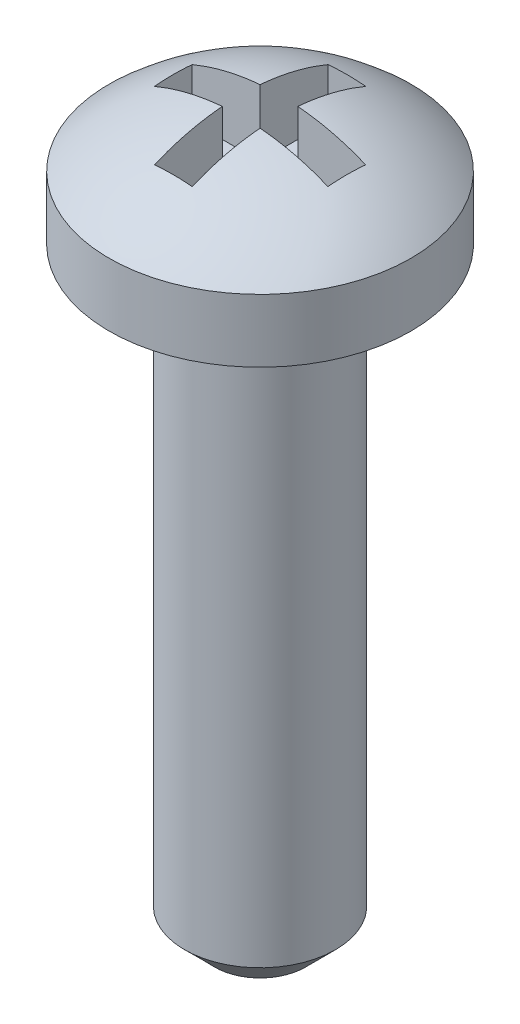
ISO-10303-21;
HEADER;
FILE_DESCRIPTION(('STEP AP214'),'2;1');
FILE_NAME('part.step','',(''),(''),'','','');
FILE_SCHEMA(('AUTOMOTIVE_DESIGN { 1 0 10303 214 1 1 1 1 }'));
ENDSEC;
DATA;
#1=APPLICATION_CONTEXT('core data for automotive mechanical design processes');
#2=APPLICATION_PROTOCOL_DEFINITION('international standard','automotive_design',2000,#1);
#3=PRODUCT_CONTEXT('',#1,'mechanical');
#4=PRODUCT('Part','Part','',(#3));
#5=PRODUCT_RELATED_PRODUCT_CATEGORY('part','',(#4));
#6=PRODUCT_DEFINITION_FORMATION('','',#4);
#7=PRODUCT_DEFINITION_CONTEXT('part definition',#1,'design');
#8=PRODUCT_DEFINITION('design','',#6,#7);
#9=PRODUCT_DEFINITION_SHAPE('','',#8);
#10=(LENGTH_UNIT() NAMED_UNIT(*) SI_UNIT(.MILLI.,.METRE.));
#11=(NAMED_UNIT(*) PLANE_ANGLE_UNIT() SI_UNIT($,.RADIAN.));
#12=(NAMED_UNIT(*) SI_UNIT($,.STERADIAN.) SOLID_ANGLE_UNIT());
#13=UNCERTAINTY_MEASURE_WITH_UNIT(LENGTH_MEASURE(1.E-05),#10,'distance_accuracy_value','');
#14=(GEOMETRIC_REPRESENTATION_CONTEXT(3) GLOBAL_UNCERTAINTY_ASSIGNED_CONTEXT((#13)) GLOBAL_UNIT_ASSIGNED_CONTEXT((#10,
#11,#12)) REPRESENTATION_CONTEXT('',''));
#15=CARTESIAN_POINT('',(0.,0.,0.));
#16=DIRECTION('',(0.,0.,1.));
#17=DIRECTION('',(1.,0.,0.));
#18=AXIS2_PLACEMENT_3D('',#15,#16,#17);
#19=CARTESIAN_POINT('',(0.,-8.,0.));
#20=DIRECTION('',(0.,-1.,0.));
#21=DIRECTION('',(1.,0.,0.));
#22=AXIS2_PLACEMENT_3D('',#19,#20,#21);
#23=CYLINDRICAL_SURFACE('',#22,1.);
#24=CARTESIAN_POINT('',(0.,-7.6,0.));
#25=DIRECTION('',(0.,-1.,0.));
#26=DIRECTION('',(1.,0.,0.));
#27=AXIS2_PLACEMENT_3D('',#24,#25,#26);
#28=CIRCLE('',#27,0.999999999999999);
#29=CARTESIAN_POINT('',(0.999999999999999,-7.6,0.));
#30=VERTEX_POINT('',#29);
#31=EDGE_CURVE('E175',#30,#30,#28,.T.);
#32=ORIENTED_EDGE('',*,*,#31,.F.);
#33=EDGE_LOOP('',(#32));
#34=FACE_BOUND('',#33,.T.);
#35=CARTESIAN_POINT('',(0.,0.,0.));
#36=DIRECTION('',(0.,-1.,0.));
#37=DIRECTION('',(1.,0.,0.));
#38=AXIS2_PLACEMENT_3D('',#35,#36,#37);
#39=CIRCLE('',#38,1.);
#40=CARTESIAN_POINT('',(1.,0.,0.));
#41=VERTEX_POINT('',#40);
#42=EDGE_CURVE('E206',#41,#41,#39,.T.);
#43=ORIENTED_EDGE('',*,*,#42,.T.);
#44=EDGE_LOOP('',(#43));
#45=FACE_BOUND('',#44,.T.);
#46=ADVANCED_FACE('F40',(#34,#45),#23,.T.);
#47=CARTESIAN_POINT('',(-2.,0.,0.));
#48=DIRECTION('',(0.,1.,0.));
#49=DIRECTION('',(-1.,0.,0.));
#50=AXIS2_PLACEMENT_3D('',#47,#48,#49);
#51=PLANE('',#50);
#52=ORIENTED_EDGE('',*,*,#42,.F.);
#53=EDGE_LOOP('',(#52));
#54=FACE_BOUND('',#53,.T.);
#55=CARTESIAN_POINT('',(0.,0.,0.));
#56=DIRECTION('',(0.,-1.,0.));
#57=DIRECTION('',(1.,0.,0.));
#58=AXIS2_PLACEMENT_3D('',#55,#56,#57);
#59=CIRCLE('',#58,2.);
#60=CARTESIAN_POINT('',(2.,0.,0.));
#61=VERTEX_POINT('',#60);
#62=EDGE_CURVE('E203',#61,#61,#59,.T.);
#63=ORIENTED_EDGE('',*,*,#62,.T.);
#64=EDGE_LOOP('',(#63));
#65=FACE_BOUND('',#64,.T.);
#66=ADVANCED_FACE('F285',(#54,#65),#51,.F.);
#67=CARTESIAN_POINT('',(0.,-8.,0.));
#68=DIRECTION('',(0.,-1.,0.));
#69=DIRECTION('',(1.,0.,0.));
#70=AXIS2_PLACEMENT_3D('',#67,#68,#69);
#71=CYLINDRICAL_SURFACE('',#70,2.);
#72=ORIENTED_EDGE('',*,*,#62,.F.);
#73=EDGE_LOOP('',(#72));
#74=FACE_BOUND('',#73,.T.);
#75=CARTESIAN_POINT('',(0.,0.836067977499791,0.));
#76=DIRECTION('',(0.,-1.,0.));
#77=DIRECTION('',(1.,0.,0.));
#78=AXIS2_PLACEMENT_3D('',#75,#76,#77);
#79=CIRCLE('',#78,2.);
#80=CARTESIAN_POINT('',(2.,0.83606797749979,0.));
#81=VERTEX_POINT('',#80);
#82=EDGE_CURVE('E200',#81,#81,#79,.T.);
#83=ORIENTED_EDGE('',*,*,#82,.T.);
#84=EDGE_LOOP('',(#83));
#85=FACE_BOUND('',#84,.T.);
#86=ADVANCED_FACE('F290',(#74,#85),#71,.T.);
#87=CARTESIAN_POINT('',(0.,-1.4,0.));
#88=DIRECTION('',(0.,-1.,0.));
#89=DIRECTION('',(1.,0.,0.));
#90=AXIS2_PLACEMENT_3D('',#87,#88,#89);
#91=SPHERICAL_SURFACE('',#90,3.);
#92=CARTESIAN_POINT('',(0.,-1.4,1.15));
#93=DIRECTION('',(0.,0.,1.));
#94=DIRECTION('',(1.,0.,0.));
#95=AXIS2_PLACEMENT_3D('',#92,#93,#94);
#96=CIRCLE('',#95,2.77083020049948);
#97=CARTESIAN_POINT('',(0.25,1.35952894530933,1.15));
#98=VERTEX_POINT('',#97);
#99=CARTESIAN_POINT('',(-0.25,1.35952894530933,1.15));
#100=VERTEX_POINT('',#99);
#101=EDGE_CURVE('E47',#98,#100,#96,.T.);
#102=ORIENTED_EDGE('',*,*,#101,.T.);
#103=CARTESIAN_POINT('',(-0.25,-1.4,0.));
#104=DIRECTION('',(-1.,0.,0.));
#105=DIRECTION('',(0.,0.,1.));
#106=AXIS2_PLACEMENT_3D('',#103,#104,#105);
#107=CIRCLE('',#106,2.98956518577535);
#108=CARTESIAN_POINT('',(-0.25,1.57909382195325,0.25));
#109=VERTEX_POINT('',#108);
#110=EDGE_CURVE('E11',#100,#109,#107,.T.);
#111=ORIENTED_EDGE('',*,*,#110,.T.);
#112=CARTESIAN_POINT('',(0.,-1.4,0.25));
#113=DIRECTION('',(0.,0.,1.));
#114=DIRECTION('',(1.,0.,0.));
#115=AXIS2_PLACEMENT_3D('',#112,#113,#114);
#116=CIRCLE('',#115,2.98956518577535);
#117=CARTESIAN_POINT('',(-1.15,1.35952894530933,0.25));
#118=VERTEX_POINT('',#117);
#119=EDGE_CURVE('E129',#109,#118,#116,.T.);
#120=ORIENTED_EDGE('',*,*,#119,.T.);
#121=CARTESIAN_POINT('',(-1.15,-1.4,0.));
#122=DIRECTION('',(-1.,0.,0.));
#123=DIRECTION('',(0.,-1.,0.));
#124=AXIS2_PLACEMENT_3D('',#121,#122,#123);
#125=CIRCLE('',#124,2.77083020049948);
#126=CARTESIAN_POINT('',(-1.15,1.35952894530933,-0.25));
#127=VERTEX_POINT('',#126);
#128=EDGE_CURVE('E210',#118,#127,#125,.T.);
#129=ORIENTED_EDGE('',*,*,#128,.T.);
#130=CARTESIAN_POINT('',(0.,-1.4,-0.25));
#131=DIRECTION('',(0.,0.,-1.));
#132=DIRECTION('',(-1.,0.,0.));
#133=AXIS2_PLACEMENT_3D('',#130,#131,#132);
#134=CIRCLE('',#133,2.98956518577535);
#135=CARTESIAN_POINT('',(-0.25,1.57909382195325,-0.25));
#136=VERTEX_POINT('',#135);
#137=EDGE_CURVE('E213',#127,#136,#134,.T.);
#138=ORIENTED_EDGE('',*,*,#137,.T.);
#139=CARTESIAN_POINT('',(-0.25,-1.4,0.));
#140=DIRECTION('',(-1.,0.,0.));
#141=DIRECTION('',(0.,0.,1.));
#142=AXIS2_PLACEMENT_3D('',#139,#140,#141);
#143=CIRCLE('',#142,2.98956518577535);
#144=CARTESIAN_POINT('',(-0.25,1.35952894530933,-1.15));
#145=VERTEX_POINT('',#144);
#146=EDGE_CURVE('E216',#136,#145,#143,.T.);
#147=ORIENTED_EDGE('',*,*,#146,.T.);
#148=CARTESIAN_POINT('',(0.,-1.4,-1.15));
#149=DIRECTION('',(0.,0.,-1.));
#150=DIRECTION('',(-1.,0.,0.));
#151=AXIS2_PLACEMENT_3D('',#148,#149,#150);
#152=CIRCLE('',#151,2.77083020049948);
#153=CARTESIAN_POINT('',(0.25,1.35952894530933,-1.15));
#154=VERTEX_POINT('',#153);
#155=EDGE_CURVE('E219',#145,#154,#152,.T.);
#156=ORIENTED_EDGE('',*,*,#155,.T.);
#157=CARTESIAN_POINT('',(0.25,-1.4,0.));
#158=DIRECTION('',(1.,0.,0.));
#159=DIRECTION('',(0.,0.,-1.));
#160=AXIS2_PLACEMENT_3D('',#157,#158,#159);
#161=CIRCLE('',#160,2.98956518577535);
#162=CARTESIAN_POINT('',(0.25,1.57909382195325,-0.25));
#163=VERTEX_POINT('',#162);
#164=EDGE_CURVE('E222',#154,#163,#161,.T.);
#165=ORIENTED_EDGE('',*,*,#164,.T.);
#166=CARTESIAN_POINT('',(0.,-1.4,-0.25));
#167=DIRECTION('',(0.,0.,-1.));
#168=DIRECTION('',(-1.,0.,0.));
#169=AXIS2_PLACEMENT_3D('',#166,#167,#168);
#170=CIRCLE('',#169,2.98956518577535);
#171=CARTESIAN_POINT('',(1.15,1.35952894530933,-0.25));
#172=VERTEX_POINT('',#171);
#173=EDGE_CURVE('E225',#163,#172,#170,.T.);
#174=ORIENTED_EDGE('',*,*,#173,.T.);
#175=CARTESIAN_POINT('',(1.15,-1.4,0.));
#176=DIRECTION('',(1.,0.,0.));
#177=DIRECTION('',(0.,0.,-1.));
#178=AXIS2_PLACEMENT_3D('',#175,#176,#177);
#179=CIRCLE('',#178,2.77083020049948);
#180=CARTESIAN_POINT('',(1.15,1.35952894530933,0.25));
#181=VERTEX_POINT('',#180);
#182=EDGE_CURVE('E228',#172,#181,#179,.T.);
#183=ORIENTED_EDGE('',*,*,#182,.T.);
#184=CARTESIAN_POINT('',(0.,-1.4,0.25));
#185=DIRECTION('',(0.,0.,1.));
#186=DIRECTION('',(1.,0.,0.));
#187=AXIS2_PLACEMENT_3D('',#184,#185,#186);
#188=CIRCLE('',#187,2.98956518577535);
#189=CARTESIAN_POINT('',(0.25,1.57909382195325,0.25));
#190=VERTEX_POINT('',#189);
#191=EDGE_CURVE('E231',#181,#190,#188,.T.);
#192=ORIENTED_EDGE('',*,*,#191,.T.);
#193=CARTESIAN_POINT('',(0.25,-1.4,0.));
#194=DIRECTION('',(1.,0.,0.));
#195=DIRECTION('',(0.,0.,-1.));
#196=AXIS2_PLACEMENT_3D('',#193,#194,#195);
#197=CIRCLE('',#196,2.98956518577535);
#198=EDGE_CURVE('E234',#190,#98,#197,.T.);
#199=ORIENTED_EDGE('',*,*,#198,.T.);
#200=EDGE_LOOP('',(#102,#111,#120,#129,#138,#147,#156,#165,#174,#183,#192,#199));
#201=FACE_BOUND('',#200,.T.);
#202=ORIENTED_EDGE('',*,*,#82,.F.);
#203=EDGE_LOOP('',(#202));
#204=FACE_BOUND('',#203,.T.);
#205=ADVANCED_FACE('F238',(#201,#204),#91,.T.);
#206=CARTESIAN_POINT('',(-0.599999999999999,-8.,0.));
#207=DIRECTION('',(0.,1.,0.));
#208=DIRECTION('',(-1.,0.,0.));
#209=AXIS2_PLACEMENT_3D('',#206,#207,#208);
#210=PLANE('',#209);
#211=CARTESIAN_POINT('',(0.,-8.,0.));
#212=DIRECTION('',(0.,-1.,0.));
#213=DIRECTION('',(1.,0.,0.));
#214=AXIS2_PLACEMENT_3D('',#211,#212,#213);
#215=CIRCLE('',#214,0.599999999999999);
#216=CARTESIAN_POINT('',(0.599999999999999,-8.,0.));
#217=VERTEX_POINT('',#216);
#218=EDGE_CURVE('E197',#217,#217,#215,.T.);
#219=ORIENTED_EDGE('',*,*,#218,.T.);
#220=EDGE_LOOP('',(#219));
#221=FACE_BOUND('',#220,.T.);
#222=ADVANCED_FACE('F303',(#221),#210,.F.);
#223=CARTESIAN_POINT('',(0.,-7.6,0.));
#224=DIRECTION('',(0.,1.,0.));
#225=DIRECTION('',(-1.,0.,0.));
#226=AXIS2_PLACEMENT_3D('',#223,#224,#225);
#227=CONICAL_SURFACE('',#226,0.999999999999999,0.785398163397447);
#228=ORIENTED_EDGE('',*,*,#218,.F.);
#229=EDGE_LOOP('',(#228));
#230=FACE_BOUND('',#229,.T.);
#231=ORIENTED_EDGE('',*,*,#31,.T.);
#232=EDGE_LOOP('',(#231));
#233=FACE_BOUND('',#232,.T.);
#234=ADVANCED_FACE('F308',(#230,#233),#227,.T.);
#235=CARTESIAN_POINT('',(-0.25,1.6,1.15));
#236=DIRECTION('',(-1.,0.,0.));
#237=DIRECTION('',(0.,0.,1.));
#238=AXIS2_PLACEMENT_3D('',#235,#236,#237);
#239=PLANE('',#238);
#240=DIRECTION('',(0.,-1.,0.));
#241=VECTOR('',#240,1.);
#242=CARTESIAN_POINT('',(-0.25,1.6,1.15));
#243=LINE('',#242,#241);
#244=CARTESIAN_POINT('',(-0.25,0.7,1.15));
#245=VERTEX_POINT('',#244);
#246=EDGE_CURVE('E145',#100,#245,#243,.T.);
#247=ORIENTED_EDGE('',*,*,#246,.T.);
#248=DIRECTION('',(0.,0.,-1.));
#249=VECTOR('',#248,1.);
#250=CARTESIAN_POINT('',(-0.25,0.7,1.15));
#251=LINE('',#250,#249);
#252=CARTESIAN_POINT('',(-0.25,0.7,0.25));
#253=VERTEX_POINT('',#252);
#254=EDGE_CURVE('E138',#245,#253,#251,.T.);
#255=ORIENTED_EDGE('',*,*,#254,.T.);
#256=DIRECTION('',(0.,-1.,0.));
#257=VECTOR('',#256,1.);
#258=CARTESIAN_POINT('',(-0.25,1.6,0.25));
#259=LINE('',#258,#257);
#260=EDGE_CURVE('E124',#109,#253,#259,.T.);
#261=ORIENTED_EDGE('',*,*,#260,.F.);
#262=ORIENTED_EDGE('',*,*,#110,.F.);
#263=EDGE_LOOP('',(#247,#255,#261,#262));
#264=FACE_BOUND('',#263,.T.);
#265=ADVANCED_FACE('F144',(#264),#239,.F.);
#266=CARTESIAN_POINT('',(-0.25,1.6,1.15));
#267=DIRECTION('',(0.,0.,1.));
#268=DIRECTION('',(1.,0.,0.));
#269=AXIS2_PLACEMENT_3D('',#266,#267,#268);
#270=PLANE('',#269);
#271=DIRECTION('',(0.,-1.,0.));
#272=VECTOR('',#271,1.);
#273=CARTESIAN_POINT('',(0.25,1.6,1.15));
#274=LINE('',#273,#272);
#275=CARTESIAN_POINT('',(0.25,0.7,1.15));
#276=VERTEX_POINT('',#275);
#277=EDGE_CURVE('E176',#98,#276,#274,.T.);
#278=ORIENTED_EDGE('',*,*,#277,.T.);
#279=DIRECTION('',(-1.,0.,0.));
#280=VECTOR('',#279,1.);
#281=CARTESIAN_POINT('',(-0.25,0.7,1.15));
#282=LINE('',#281,#280);
#283=EDGE_CURVE('E131',#276,#245,#282,.T.);
#284=ORIENTED_EDGE('',*,*,#283,.T.);
#285=ORIENTED_EDGE('',*,*,#246,.F.);
#286=ORIENTED_EDGE('',*,*,#101,.F.);
#287=EDGE_LOOP('',(#278,#284,#285,#286));
#288=FACE_BOUND('',#287,.T.);
#289=ADVANCED_FACE('F242',(#288),#270,.F.);
#290=CARTESIAN_POINT('',(0.25,1.6,1.15));
#291=DIRECTION('',(1.,0.,0.));
#292=DIRECTION('',(0.,0.,-1.));
#293=AXIS2_PLACEMENT_3D('',#290,#291,#292);
#294=PLANE('',#293);
#295=DIRECTION('',(0.,-1.,0.));
#296=VECTOR('',#295,1.);
#297=CARTESIAN_POINT('',(0.25,1.6,0.25));
#298=LINE('',#297,#296);
#299=CARTESIAN_POINT('',(0.25,0.7,0.25));
#300=VERTEX_POINT('',#299);
#301=EDGE_CURVE('E178',#190,#300,#298,.T.);
#302=ORIENTED_EDGE('',*,*,#301,.T.);
#303=DIRECTION('',(0.,0.,1.));
#304=VECTOR('',#303,1.);
#305=CARTESIAN_POINT('',(0.25,0.7,1.15));
#306=LINE('',#305,#304);
#307=EDGE_CURVE('E170',#300,#276,#306,.T.);
#308=ORIENTED_EDGE('',*,*,#307,.T.);
#309=ORIENTED_EDGE('',*,*,#277,.F.);
#310=ORIENTED_EDGE('',*,*,#198,.F.);
#311=EDGE_LOOP('',(#302,#308,#309,#310));
#312=FACE_BOUND('',#311,.T.);
#313=ADVANCED_FACE('F244',(#312),#294,.F.);
#314=CARTESIAN_POINT('',(0.25,1.6,0.25));
#315=DIRECTION('',(0.,0.,1.));
#316=DIRECTION('',(1.,0.,0.));
#317=AXIS2_PLACEMENT_3D('',#314,#315,#316);
#318=PLANE('',#317);
#319=DIRECTION('',(0.,-1.,0.));
#320=VECTOR('',#319,1.);
#321=CARTESIAN_POINT('',(1.15,1.6,0.25));
#322=LINE('',#321,#320);
#323=CARTESIAN_POINT('',(1.15,0.7,0.25));
#324=VERTEX_POINT('',#323);
#325=EDGE_CURVE('E180',#181,#324,#322,.T.);
#326=ORIENTED_EDGE('',*,*,#325,.T.);
#327=DIRECTION('',(-1.,0.,0.));
#328=VECTOR('',#327,1.);
#329=CARTESIAN_POINT('',(0.25,0.7,0.25));
#330=LINE('',#329,#328);
#331=EDGE_CURVE('E167',#324,#300,#330,.T.);
#332=ORIENTED_EDGE('',*,*,#331,.T.);
#333=ORIENTED_EDGE('',*,*,#301,.F.);
#334=ORIENTED_EDGE('',*,*,#191,.F.);
#335=EDGE_LOOP('',(#326,#332,#333,#334));
#336=FACE_BOUND('',#335,.T.);
#337=ADVANCED_FACE('F250',(#336),#318,.F.);
#338=CARTESIAN_POINT('',(1.15,1.6,0.25));
#339=DIRECTION('',(1.,0.,0.));
#340=DIRECTION('',(0.,0.,-1.));
#341=AXIS2_PLACEMENT_3D('',#338,#339,#340);
#342=PLANE('',#341);
#343=DIRECTION('',(0.,-1.,0.));
#344=VECTOR('',#343,1.);
#345=CARTESIAN_POINT('',(1.15,1.6,-0.25));
#346=LINE('',#345,#344);
#347=CARTESIAN_POINT('',(1.15,0.7,-0.25));
#348=VERTEX_POINT('',#347);
#349=EDGE_CURVE('E182',#172,#348,#346,.T.);
#350=ORIENTED_EDGE('',*,*,#349,.T.);
#351=DIRECTION('',(0.,0.,1.));
#352=VECTOR('',#351,1.);
#353=CARTESIAN_POINT('',(1.15,0.7,0.25));
#354=LINE('',#353,#352);
#355=EDGE_CURVE('E164',#348,#324,#354,.T.);
#356=ORIENTED_EDGE('',*,*,#355,.T.);
#357=ORIENTED_EDGE('',*,*,#325,.F.);
#358=ORIENTED_EDGE('',*,*,#182,.F.);
#359=EDGE_LOOP('',(#350,#356,#357,#358));
#360=FACE_BOUND('',#359,.T.);
#361=ADVANCED_FACE('F253',(#360),#342,.F.);
#362=CARTESIAN_POINT('',(0.25,1.6,-0.25));
#363=DIRECTION('',(0.,0.,-1.));
#364=DIRECTION('',(-1.,0.,0.));
#365=AXIS2_PLACEMENT_3D('',#362,#363,#364);
#366=PLANE('',#365);
#367=DIRECTION('',(0.,-1.,0.));
#368=VECTOR('',#367,1.);
#369=CARTESIAN_POINT('',(0.25,1.6,-0.25));
#370=LINE('',#369,#368);
#371=CARTESIAN_POINT('',(0.25,0.7,-0.25));
#372=VERTEX_POINT('',#371);
#373=EDGE_CURVE('E184',#163,#372,#370,.T.);
#374=ORIENTED_EDGE('',*,*,#373,.T.);
#375=DIRECTION('',(1.,0.,0.));
#376=VECTOR('',#375,1.);
#377=CARTESIAN_POINT('',(0.25,0.7,-0.25));
#378=LINE('',#377,#376);
#379=EDGE_CURVE('E161',#372,#348,#378,.T.);
#380=ORIENTED_EDGE('',*,*,#379,.T.);
#381=ORIENTED_EDGE('',*,*,#349,.F.);
#382=ORIENTED_EDGE('',*,*,#173,.F.);
#383=EDGE_LOOP('',(#374,#380,#381,#382));
#384=FACE_BOUND('',#383,.T.);
#385=ADVANCED_FACE('F257',(#384),#366,.F.);
#386=CARTESIAN_POINT('',(0.25,1.6,-0.25));
#387=DIRECTION('',(1.,0.,0.));
#388=DIRECTION('',(0.,0.,-1.));
#389=AXIS2_PLACEMENT_3D('',#386,#387,#388);
#390=PLANE('',#389);
#391=DIRECTION('',(0.,-1.,0.));
#392=VECTOR('',#391,1.);
#393=CARTESIAN_POINT('',(0.25,1.6,-1.15));
#394=LINE('',#393,#392);
#395=CARTESIAN_POINT('',(0.25,0.7,-1.15));
#396=VERTEX_POINT('',#395);
#397=EDGE_CURVE('E186',#154,#396,#394,.T.);
#398=ORIENTED_EDGE('',*,*,#397,.T.);
#399=DIRECTION('',(0.,0.,1.));
#400=VECTOR('',#399,1.);
#401=CARTESIAN_POINT('',(0.25,0.7,-0.25));
#402=LINE('',#401,#400);
#403=EDGE_CURVE('E158',#396,#372,#402,.T.);
#404=ORIENTED_EDGE('',*,*,#403,.T.);
#405=ORIENTED_EDGE('',*,*,#373,.F.);
#406=ORIENTED_EDGE('',*,*,#164,.F.);
#407=EDGE_LOOP('',(#398,#404,#405,#406));
#408=FACE_BOUND('',#407,.T.);
#409=ADVANCED_FACE('F260',(#408),#390,.F.);
#410=CARTESIAN_POINT('',(-0.25,1.6,-1.15));
#411=DIRECTION('',(0.,0.,-1.));
#412=DIRECTION('',(-1.,0.,0.));
#413=AXIS2_PLACEMENT_3D('',#410,#411,#412);
#414=PLANE('',#413);
#415=DIRECTION('',(0.,-1.,0.));
#416=VECTOR('',#415,1.);
#417=CARTESIAN_POINT('',(-0.25,1.6,-1.15));
#418=LINE('',#417,#416);
#419=CARTESIAN_POINT('',(-0.25,0.7,-1.15));
#420=VERTEX_POINT('',#419);
#421=EDGE_CURVE('E188',#145,#420,#418,.T.);
#422=ORIENTED_EDGE('',*,*,#421,.T.);
#423=DIRECTION('',(1.,0.,0.));
#424=VECTOR('',#423,1.);
#425=CARTESIAN_POINT('',(-0.25,0.7,-1.15));
#426=LINE('',#425,#424);
#427=EDGE_CURVE('E155',#420,#396,#426,.T.);
#428=ORIENTED_EDGE('',*,*,#427,.T.);
#429=ORIENTED_EDGE('',*,*,#397,.F.);
#430=ORIENTED_EDGE('',*,*,#155,.F.);
#431=EDGE_LOOP('',(#422,#428,#429,#430));
#432=FACE_BOUND('',#431,.T.);
#433=ADVANCED_FACE('F266',(#432),#414,.F.);
#434=CARTESIAN_POINT('',(-0.25,1.6,-0.25));
#435=DIRECTION('',(-1.,0.,0.));
#436=DIRECTION('',(0.,0.,1.));
#437=AXIS2_PLACEMENT_3D('',#434,#435,#436);
#438=PLANE('',#437);
#439=DIRECTION('',(0.,-1.,0.));
#440=VECTOR('',#439,1.);
#441=CARTESIAN_POINT('',(-0.25,1.6,-0.25));
#442=LINE('',#441,#440);
#443=CARTESIAN_POINT('',(-0.25,0.7,-0.25));
#444=VERTEX_POINT('',#443);
#445=EDGE_CURVE('E190',#136,#444,#442,.T.);
#446=ORIENTED_EDGE('',*,*,#445,.T.);
#447=DIRECTION('',(0.,0.,-1.));
#448=VECTOR('',#447,1.);
#449=CARTESIAN_POINT('',(-0.25,0.7,-0.25));
#450=LINE('',#449,#448);
#451=EDGE_CURVE('E152',#444,#420,#450,.T.);
#452=ORIENTED_EDGE('',*,*,#451,.T.);
#453=ORIENTED_EDGE('',*,*,#421,.F.);
#454=ORIENTED_EDGE('',*,*,#146,.F.);
#455=EDGE_LOOP('',(#446,#452,#453,#454));
#456=FACE_BOUND('',#455,.T.);
#457=ADVANCED_FACE('F269',(#456),#438,.F.);
#458=CARTESIAN_POINT('',(-1.15,1.6,-0.25));
#459=DIRECTION('',(0.,0.,-1.));
#460=DIRECTION('',(-1.,0.,0.));
#461=AXIS2_PLACEMENT_3D('',#458,#459,#460);
#462=PLANE('',#461);
#463=DIRECTION('',(0.,-1.,0.));
#464=VECTOR('',#463,1.);
#465=CARTESIAN_POINT('',(-1.15,1.6,-0.25));
#466=LINE('',#465,#464);
#467=CARTESIAN_POINT('',(-1.15,0.7,-0.25));
#468=VERTEX_POINT('',#467);
#469=EDGE_CURVE('E192',#127,#468,#466,.T.);
#470=ORIENTED_EDGE('',*,*,#469,.T.);
#471=DIRECTION('',(1.,0.,0.));
#472=VECTOR('',#471,1.);
#473=CARTESIAN_POINT('',(-1.15,0.7,-0.25));
#474=LINE('',#473,#472);
#475=EDGE_CURVE('E149',#468,#444,#474,.T.);
#476=ORIENTED_EDGE('',*,*,#475,.T.);
#477=ORIENTED_EDGE('',*,*,#445,.F.);
#478=ORIENTED_EDGE('',*,*,#137,.F.);
#479=EDGE_LOOP('',(#470,#476,#477,#478));
#480=FACE_BOUND('',#479,.T.);
#481=ADVANCED_FACE('F273',(#480),#462,.F.);
#482=CARTESIAN_POINT('',(-1.15,1.6,0.25));
#483=DIRECTION('',(-1.,0.,0.));
#484=DIRECTION('',(0.,-1.,0.));
#485=AXIS2_PLACEMENT_3D('',#482,#483,#484);
#486=PLANE('',#485);
#487=DIRECTION('',(0.,-1.,0.));
#488=VECTOR('',#487,1.);
#489=CARTESIAN_POINT('',(-1.15,1.6,0.25));
#490=LINE('',#489,#488);
#491=CARTESIAN_POINT('',(-1.15,0.7,0.25));
#492=VERTEX_POINT('',#491);
#493=EDGE_CURVE('E54',#118,#492,#490,.T.);
#494=ORIENTED_EDGE('',*,*,#493,.T.);
#495=DIRECTION('',(0.,0.,-1.));
#496=VECTOR('',#495,1.);
#497=CARTESIAN_POINT('',(-1.15,0.7,0.25));
#498=LINE('',#497,#496);
#499=EDGE_CURVE('E142',#492,#468,#498,.T.);
#500=ORIENTED_EDGE('',*,*,#499,.T.);
#501=ORIENTED_EDGE('',*,*,#469,.F.);
#502=ORIENTED_EDGE('',*,*,#128,.F.);
#503=EDGE_LOOP('',(#494,#500,#501,#502));
#504=FACE_BOUND('',#503,.T.);
#505=ADVANCED_FACE('F275',(#504),#486,.F.);
#506=CARTESIAN_POINT('',(-1.15,1.6,0.25));
#507=DIRECTION('',(0.,0.,1.));
#508=DIRECTION('',(1.,0.,0.));
#509=AXIS2_PLACEMENT_3D('',#506,#507,#508);
#510=PLANE('',#509);
#511=ORIENTED_EDGE('',*,*,#260,.T.);
#512=DIRECTION('',(-1.,0.,0.));
#513=VECTOR('',#512,1.);
#514=CARTESIAN_POINT('',(-1.15,0.7,0.25));
#515=LINE('',#514,#513);
#516=EDGE_CURVE('E127',#253,#492,#515,.T.);
#517=ORIENTED_EDGE('',*,*,#516,.T.);
#518=ORIENTED_EDGE('',*,*,#493,.F.);
#519=ORIENTED_EDGE('',*,*,#119,.F.);
#520=EDGE_LOOP('',(#511,#517,#518,#519));
#521=FACE_BOUND('',#520,.T.);
#522=ADVANCED_FACE('F126',(#521),#510,.F.);
#523=CARTESIAN_POINT('',(0.,0.7,0.));
#524=DIRECTION('',(0.,-1.,0.));
#525=DIRECTION('',(1.,0.,0.));
#526=AXIS2_PLACEMENT_3D('',#523,#524,#525);
#527=PLANE('',#526);
#528=ORIENTED_EDGE('',*,*,#254,.F.);
#529=ORIENTED_EDGE('',*,*,#283,.F.);
#530=ORIENTED_EDGE('',*,*,#307,.F.);
#531=ORIENTED_EDGE('',*,*,#331,.F.);
#532=ORIENTED_EDGE('',*,*,#355,.F.);
#533=ORIENTED_EDGE('',*,*,#379,.F.);
#534=ORIENTED_EDGE('',*,*,#403,.F.);
#535=ORIENTED_EDGE('',*,*,#427,.F.);
#536=ORIENTED_EDGE('',*,*,#451,.F.);
#537=ORIENTED_EDGE('',*,*,#475,.F.);
#538=ORIENTED_EDGE('',*,*,#499,.F.);
#539=ORIENTED_EDGE('',*,*,#516,.F.);
#540=EDGE_LOOP('',(#528,#529,#530,#531,#532,#533,#534,#535,#536,#537,#538,#539));
#541=FACE_BOUND('',#540,.T.);
#542=ADVANCED_FACE('F136',(#541),#527,.F.);
#543=CLOSED_SHELL('',(#46,#66,#86,#205,#222,#234,#265,#289,#313,#337,#361,#385,#409,#433,#457,
#481,#505,#522,#542));
#544=MANIFOLD_SOLID_BREP('B2',#543);
#545=ADVANCED_BREP_SHAPE_REPRESENTATION('',(#18,#544),#14);
#546=SHAPE_DEFINITION_REPRESENTATION(#9,#545);
ENDSEC;
END-ISO-10303-21;
